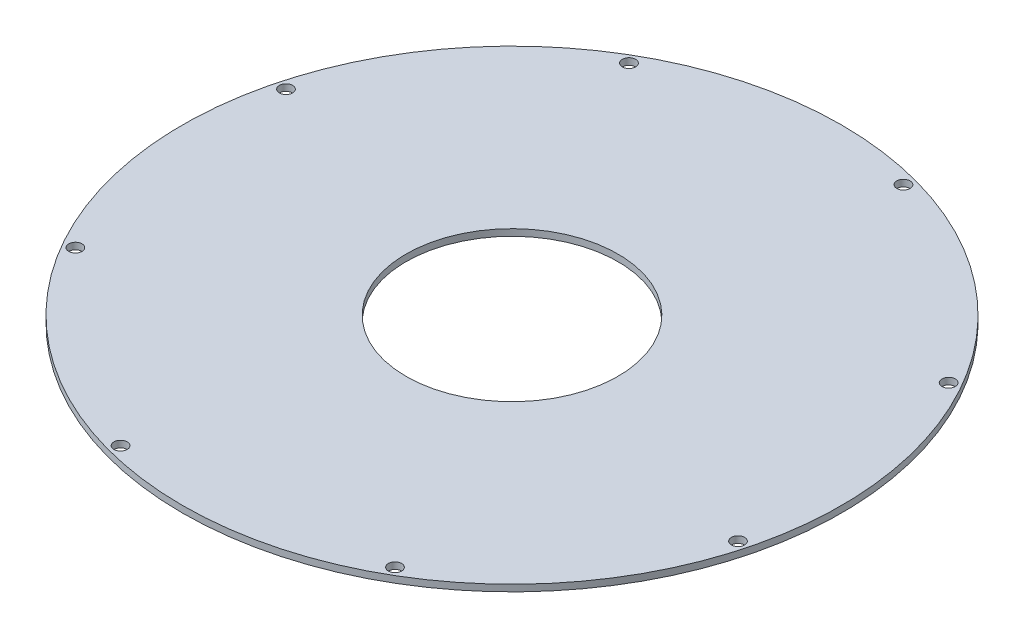
ISO-10303-21;
HEADER;
FILE_DESCRIPTION(('STEP AP214'),'2;1');
FILE_NAME('part.step','',(''),(''),'','','');
FILE_SCHEMA(('AUTOMOTIVE_DESIGN { 1 0 10303 214 1 1 1 1 }'));
ENDSEC;
DATA;
#1=APPLICATION_CONTEXT('core data for automotive mechanical design processes');
#2=APPLICATION_PROTOCOL_DEFINITION('international standard','automotive_design',2000,#1);
#3=PRODUCT_CONTEXT('',#1,'mechanical');
#4=PRODUCT('Part','Part','',(#3));
#5=PRODUCT_RELATED_PRODUCT_CATEGORY('part','',(#4));
#6=PRODUCT_DEFINITION_FORMATION('','',#4);
#7=PRODUCT_DEFINITION_CONTEXT('part definition',#1,'design');
#8=PRODUCT_DEFINITION('design','',#6,#7);
#9=PRODUCT_DEFINITION_SHAPE('','',#8);
#10=(LENGTH_UNIT() NAMED_UNIT(*) SI_UNIT(.MILLI.,.METRE.));
#11=(NAMED_UNIT(*) PLANE_ANGLE_UNIT() SI_UNIT($,.RADIAN.));
#12=(NAMED_UNIT(*) SI_UNIT($,.STERADIAN.) SOLID_ANGLE_UNIT());
#13=UNCERTAINTY_MEASURE_WITH_UNIT(LENGTH_MEASURE(1.E-05),#10,'distance_accuracy_value','');
#14=(GEOMETRIC_REPRESENTATION_CONTEXT(3) GLOBAL_UNCERTAINTY_ASSIGNED_CONTEXT((#13)) GLOBAL_UNIT_ASSIGNED_CONTEXT((#10,
#11,#12)) REPRESENTATION_CONTEXT('',''));
#15=CARTESIAN_POINT('',(0.,0.,0.));
#16=DIRECTION('',(0.,0.,1.));
#17=DIRECTION('',(1.,0.,0.));
#18=AXIS2_PLACEMENT_3D('',#15,#16,#17);
#19=CARTESIAN_POINT('',(0.,1.,0.));
#20=DIRECTION('',(0.,1.,0.));
#21=DIRECTION('',(0.,0.,1.));
#22=AXIS2_PLACEMENT_3D('',#19,#20,#21);
#23=PLANE('',#22);
#24=CARTESIAN_POINT('',(-48.2500000000007,1.,-83.5714514651979));
#25=DIRECTION('',(0.,1.,0.));
#26=DIRECTION('',(0.707106781186549,0.,0.707106781186546));
#27=AXIS2_PLACEMENT_3D('',#24,#25,#26);
#28=CIRCLE('',#27,2.);
#29=CARTESIAN_POINT('',(-46.8357864376276,1.,-82.1572379028248));
#30=VERTEX_POINT('',#29);
#31=EDGE_CURVE('E96',#30,#30,#28,.T.);
#32=ORIENTED_EDGE('',*,*,#31,.F.);
#33=EDGE_LOOP('',(#32));
#34=FACE_BOUND('',#33,.T.);
#35=CARTESIAN_POINT('',(-93.2118422368954,1.,-24.9760378523923));
#36=DIRECTION('',(0.,1.,0.));
#37=DIRECTION('',(1.,0.,0.));
#38=AXIS2_PLACEMENT_3D('',#35,#36,#37);
#39=CIRCLE('',#38,2.);
#40=CARTESIAN_POINT('',(-91.2118422368954,1.,-24.9760378523923));
#41=VERTEX_POINT('',#40);
#42=EDGE_CURVE('E90',#41,#41,#39,.T.);
#43=ORIENTED_EDGE('',*,*,#42,.F.);
#44=EDGE_LOOP('',(#43));
#45=FACE_BOUND('',#44,.T.);
#46=CARTESIAN_POINT('',(-83.5714514651978,1.,48.250000000001));
#47=DIRECTION('',(0.,1.,0.));
#48=DIRECTION('',(0.707106781186544,0.,-0.707106781186551));
#49=AXIS2_PLACEMENT_3D('',#46,#47,#48);
#50=CIRCLE('',#49,2.);
#51=CARTESIAN_POINT('',(-82.1572379028247,1.,46.8357864376279));
#52=VERTEX_POINT('',#51);
#53=EDGE_CURVE('E84',#52,#52,#50,.T.);
#54=ORIENTED_EDGE('',*,*,#53,.F.);
#55=EDGE_LOOP('',(#54));
#56=FACE_BOUND('',#55,.T.);
#57=CARTESIAN_POINT('',(-24.9760378523926,1.,93.2118422368953));
#58=DIRECTION('',(0.,1.,0.));
#59=DIRECTION('',(0.,0.,-1.));
#60=AXIS2_PLACEMENT_3D('',#57,#58,#59);
#61=CIRCLE('',#60,2.);
#62=CARTESIAN_POINT('',(-24.9760378523926,1.,91.2118422368953));
#63=VERTEX_POINT('',#62);
#64=EDGE_CURVE('E78',#63,#63,#61,.T.);
#65=ORIENTED_EDGE('',*,*,#64,.F.);
#66=EDGE_LOOP('',(#65));
#67=FACE_BOUND('',#66,.T.);
#68=CARTESIAN_POINT('',(48.2500000000013,1.,83.5714514651976));
#69=DIRECTION('',(0.,1.,0.));
#70=DIRECTION('',(-0.707106781186554,0.,-0.707106781186541));
#71=AXIS2_PLACEMENT_3D('',#68,#69,#70);
#72=CIRCLE('',#71,2.);
#73=CARTESIAN_POINT('',(46.8357864376282,1.,82.1572379028245));
#74=VERTEX_POINT('',#73);
#75=EDGE_CURVE('E72',#74,#74,#72,.T.);
#76=ORIENTED_EDGE('',*,*,#75,.F.);
#77=EDGE_LOOP('',(#76));
#78=FACE_BOUND('',#77,.T.);
#79=CARTESIAN_POINT('',(93.2118422368955,1.,24.9760378523917));
#80=DIRECTION('',(0.,1.,0.));
#81=DIRECTION('',(-1.,0.,0.));
#82=AXIS2_PLACEMENT_3D('',#79,#80,#81);
#83=CIRCLE('',#82,2.);
#84=CARTESIAN_POINT('',(91.2118422368955,1.,24.9760378523917));
#85=VERTEX_POINT('',#84);
#86=EDGE_CURVE('E66',#85,#85,#83,.T.);
#87=ORIENTED_EDGE('',*,*,#86,.F.);
#88=EDGE_LOOP('',(#87));
#89=FACE_BOUND('',#88,.T.);
#90=CARTESIAN_POINT('',(83.5714514651974,1.,-48.2500000000016));
#91=DIRECTION('',(0.,1.,0.));
#92=DIRECTION('',(-0.707106781186539,0.,0.707106781186556));
#93=AXIS2_PLACEMENT_3D('',#90,#91,#92);
#94=CIRCLE('',#93,2.);
#95=CARTESIAN_POINT('',(82.1572379028243,1.,-46.8357864376285));
#96=VERTEX_POINT('',#95);
#97=EDGE_CURVE('E60',#96,#96,#94,.T.);
#98=ORIENTED_EDGE('',*,*,#97,.F.);
#99=EDGE_LOOP('',(#98));
#100=FACE_BOUND('',#99,.T.);
#101=CARTESIAN_POINT('',(24.9760378523926,1.,-93.2118422368953));
#102=DIRECTION('',(0.,1.,0.));
#103=DIRECTION('',(0.,0.,1.));
#104=AXIS2_PLACEMENT_3D('',#101,#102,#103);
#105=CIRCLE('',#104,2.);
#106=CARTESIAN_POINT('',(24.9760378523926,1.,-91.2118422368953));
#107=VERTEX_POINT('',#106);
#108=EDGE_CURVE('E54',#107,#107,#105,.T.);
#109=ORIENTED_EDGE('',*,*,#108,.F.);
#110=EDGE_LOOP('',(#109));
#111=FACE_BOUND('',#110,.T.);
#112=CARTESIAN_POINT('',(0.,1.,0.));
#113=DIRECTION('',(0.,1.,0.));
#114=DIRECTION('',(0.,0.,1.));
#115=AXIS2_PLACEMENT_3D('',#112,#113,#114);
#116=CIRCLE('',#115,99.5);
#117=CARTESIAN_POINT('',(0.,1.,99.5));
#118=VERTEX_POINT('',#117);
#119=EDGE_CURVE('E10',#118,#118,#116,.T.);
#120=ORIENTED_EDGE('',*,*,#119,.T.);
#121=EDGE_LOOP('',(#120));
#122=FACE_BOUND('',#121,.T.);
#123=CARTESIAN_POINT('',(0.,1.,0.));
#124=DIRECTION('',(0.,1.,0.));
#125=DIRECTION('',(0.,0.,1.));
#126=AXIS2_PLACEMENT_3D('',#123,#124,#125);
#127=CIRCLE('',#126,32.);
#128=CARTESIAN_POINT('',(0.,1.,32.));
#129=VERTEX_POINT('',#128);
#130=EDGE_CURVE('E46',#129,#129,#127,.T.);
#131=ORIENTED_EDGE('',*,*,#130,.F.);
#132=EDGE_LOOP('',(#131));
#133=FACE_BOUND('',#132,.T.);
#134=ADVANCED_FACE('F35',(#34,#45,#56,#67,#78,#89,#100,#111,#122,#133),#23,.T.);
#135=CARTESIAN_POINT('',(0.,-1.,0.));
#136=DIRECTION('',(0.,1.,0.));
#137=DIRECTION('',(0.,0.,1.));
#138=AXIS2_PLACEMENT_3D('',#135,#136,#137);
#139=PLANE('',#138);
#140=CARTESIAN_POINT('',(-48.2500000000007,-1.,-83.5714514651979));
#141=DIRECTION('',(0.,1.,0.));
#142=DIRECTION('',(0.707106781186549,0.,0.707106781186546));
#143=AXIS2_PLACEMENT_3D('',#140,#141,#142);
#144=CIRCLE('',#143,2.);
#145=CARTESIAN_POINT('',(-46.8357864376276,-1.,-82.1572379028248));
#146=VERTEX_POINT('',#145);
#147=EDGE_CURVE('E57',#146,#146,#144,.T.);
#148=ORIENTED_EDGE('',*,*,#147,.T.);
#149=EDGE_LOOP('',(#148));
#150=FACE_BOUND('',#149,.T.);
#151=CARTESIAN_POINT('',(-93.2118422368954,-1.,-24.9760378523923));
#152=DIRECTION('',(0.,1.,0.));
#153=DIRECTION('',(1.,0.,0.));
#154=AXIS2_PLACEMENT_3D('',#151,#152,#153);
#155=CIRCLE('',#154,2.);
#156=CARTESIAN_POINT('',(-91.2118422368954,-1.,-24.9760378523923));
#157=VERTEX_POINT('',#156);
#158=EDGE_CURVE('E93',#157,#157,#155,.T.);
#159=ORIENTED_EDGE('',*,*,#158,.T.);
#160=EDGE_LOOP('',(#159));
#161=FACE_BOUND('',#160,.T.);
#162=CARTESIAN_POINT('',(-83.5714514651978,-1.,48.250000000001));
#163=DIRECTION('',(0.,1.,0.));
#164=DIRECTION('',(0.707106781186544,0.,-0.707106781186551));
#165=AXIS2_PLACEMENT_3D('',#162,#163,#164);
#166=CIRCLE('',#165,2.);
#167=CARTESIAN_POINT('',(-82.1572379028247,-1.,46.8357864376279));
#168=VERTEX_POINT('',#167);
#169=EDGE_CURVE('E87',#168,#168,#166,.T.);
#170=ORIENTED_EDGE('',*,*,#169,.T.);
#171=EDGE_LOOP('',(#170));
#172=FACE_BOUND('',#171,.T.);
#173=CARTESIAN_POINT('',(-24.9760378523926,-1.,93.2118422368953));
#174=DIRECTION('',(0.,1.,0.));
#175=DIRECTION('',(0.,0.,-1.));
#176=AXIS2_PLACEMENT_3D('',#173,#174,#175);
#177=CIRCLE('',#176,2.);
#178=CARTESIAN_POINT('',(-24.9760378523926,-1.,91.2118422368953));
#179=VERTEX_POINT('',#178);
#180=EDGE_CURVE('E81',#179,#179,#177,.T.);
#181=ORIENTED_EDGE('',*,*,#180,.T.);
#182=EDGE_LOOP('',(#181));
#183=FACE_BOUND('',#182,.T.);
#184=CARTESIAN_POINT('',(48.2500000000013,-1.,83.5714514651976));
#185=DIRECTION('',(0.,1.,0.));
#186=DIRECTION('',(-0.707106781186554,0.,-0.707106781186541));
#187=AXIS2_PLACEMENT_3D('',#184,#185,#186);
#188=CIRCLE('',#187,2.);
#189=CARTESIAN_POINT('',(46.8357864376282,-1.,82.1572379028245));
#190=VERTEX_POINT('',#189);
#191=EDGE_CURVE('E75',#190,#190,#188,.T.);
#192=ORIENTED_EDGE('',*,*,#191,.T.);
#193=EDGE_LOOP('',(#192));
#194=FACE_BOUND('',#193,.T.);
#195=CARTESIAN_POINT('',(93.2118422368955,-1.,24.9760378523917));
#196=DIRECTION('',(0.,1.,0.));
#197=DIRECTION('',(-1.,0.,0.));
#198=AXIS2_PLACEMENT_3D('',#195,#196,#197);
#199=CIRCLE('',#198,2.);
#200=CARTESIAN_POINT('',(91.2118422368955,-1.,24.9760378523917));
#201=VERTEX_POINT('',#200);
#202=EDGE_CURVE('E69',#201,#201,#199,.T.);
#203=ORIENTED_EDGE('',*,*,#202,.T.);
#204=EDGE_LOOP('',(#203));
#205=FACE_BOUND('',#204,.T.);
#206=CARTESIAN_POINT('',(83.5714514651974,-1.,-48.2500000000016));
#207=DIRECTION('',(0.,1.,0.));
#208=DIRECTION('',(-0.707106781186539,0.,0.707106781186556));
#209=AXIS2_PLACEMENT_3D('',#206,#207,#208);
#210=CIRCLE('',#209,2.);
#211=CARTESIAN_POINT('',(82.1572379028243,-1.,-46.8357864376285));
#212=VERTEX_POINT('',#211);
#213=EDGE_CURVE('E63',#212,#212,#210,.T.);
#214=ORIENTED_EDGE('',*,*,#213,.T.);
#215=EDGE_LOOP('',(#214));
#216=FACE_BOUND('',#215,.T.);
#217=CARTESIAN_POINT('',(24.9760378523926,-1.,-93.2118422368953));
#218=DIRECTION('',(0.,1.,0.));
#219=DIRECTION('',(0.,0.,1.));
#220=AXIS2_PLACEMENT_3D('',#217,#218,#219);
#221=CIRCLE('',#220,2.);
#222=CARTESIAN_POINT('',(24.9760378523926,-1.,-91.2118422368953));
#223=VERTEX_POINT('',#222);
#224=EDGE_CURVE('E51',#223,#223,#221,.T.);
#225=ORIENTED_EDGE('',*,*,#224,.T.);
#226=EDGE_LOOP('',(#225));
#227=FACE_BOUND('',#226,.T.);
#228=CARTESIAN_POINT('',(0.,-1.,0.));
#229=DIRECTION('',(0.,1.,0.));
#230=DIRECTION('',(0.,0.,1.));
#231=AXIS2_PLACEMENT_3D('',#228,#229,#230);
#232=CIRCLE('',#231,99.5);
#233=CARTESIAN_POINT('',(0.,-1.,99.5));
#234=VERTEX_POINT('',#233);
#235=EDGE_CURVE('E39',#234,#234,#232,.T.);
#236=ORIENTED_EDGE('',*,*,#235,.F.);
#237=EDGE_LOOP('',(#236));
#238=FACE_BOUND('',#237,.T.);
#239=CARTESIAN_POINT('',(0.,-1.,0.));
#240=DIRECTION('',(0.,1.,0.));
#241=DIRECTION('',(0.,0.,1.));
#242=AXIS2_PLACEMENT_3D('',#239,#240,#241);
#243=CIRCLE('',#242,32.);
#244=CARTESIAN_POINT('',(0.,-1.,32.));
#245=VERTEX_POINT('',#244);
#246=EDGE_CURVE('E48',#245,#245,#243,.T.);
#247=ORIENTED_EDGE('',*,*,#246,.T.);
#248=EDGE_LOOP('',(#247));
#249=FACE_BOUND('',#248,.T.);
#250=ADVANCED_FACE('F102',(#150,#161,#172,#183,#194,#205,#216,#227,#238,#249),#139,.F.);
#251=CARTESIAN_POINT('',(0.,1.,0.));
#252=DIRECTION('',(0.,-1.,0.));
#253=DIRECTION('',(0.,0.,-1.));
#254=AXIS2_PLACEMENT_3D('',#251,#252,#253);
#255=CYLINDRICAL_SURFACE('',#254,99.5);
#256=ORIENTED_EDGE('',*,*,#119,.F.);
#257=EDGE_LOOP('',(#256));
#258=FACE_BOUND('',#257,.T.);
#259=ORIENTED_EDGE('',*,*,#235,.T.);
#260=EDGE_LOOP('',(#259));
#261=FACE_BOUND('',#260,.T.);
#262=ADVANCED_FACE('F37',(#258,#261),#255,.T.);
#263=CARTESIAN_POINT('',(0.,1.,0.));
#264=DIRECTION('',(0.,-1.,0.));
#265=DIRECTION('',(0.,0.,-1.));
#266=AXIS2_PLACEMENT_3D('',#263,#264,#265);
#267=CYLINDRICAL_SURFACE('',#266,32.);
#268=ORIENTED_EDGE('',*,*,#130,.T.);
#269=EDGE_LOOP('',(#268));
#270=FACE_BOUND('',#269,.T.);
#271=ORIENTED_EDGE('',*,*,#246,.F.);
#272=EDGE_LOOP('',(#271));
#273=FACE_BOUND('',#272,.T.);
#274=ADVANCED_FACE('F131',(#270,#273),#267,.F.);
#275=CARTESIAN_POINT('',(24.9760378523926,-1.,-93.2118422368953));
#276=DIRECTION('',(0.,1.,0.));
#277=DIRECTION('',(0.,0.,1.));
#278=AXIS2_PLACEMENT_3D('',#275,#276,#277);
#279=CYLINDRICAL_SURFACE('',#278,2.);
#280=ORIENTED_EDGE('',*,*,#224,.F.);
#281=EDGE_LOOP('',(#280));
#282=FACE_BOUND('',#281,.T.);
#283=ORIENTED_EDGE('',*,*,#108,.T.);
#284=EDGE_LOOP('',(#283));
#285=FACE_BOUND('',#284,.T.);
#286=ADVANCED_FACE('F134',(#282,#285),#279,.F.);
#287=CARTESIAN_POINT('',(83.5714514651974,-1.,-48.2500000000016));
#288=DIRECTION('',(0.,1.,0.));
#289=DIRECTION('',(0.,0.,1.));
#290=AXIS2_PLACEMENT_3D('',#287,#288,#289);
#291=CYLINDRICAL_SURFACE('',#290,2.);
#292=ORIENTED_EDGE('',*,*,#213,.F.);
#293=EDGE_LOOP('',(#292));
#294=FACE_BOUND('',#293,.T.);
#295=ORIENTED_EDGE('',*,*,#97,.T.);
#296=EDGE_LOOP('',(#295));
#297=FACE_BOUND('',#296,.T.);
#298=ADVANCED_FACE('F146',(#294,#297),#291,.F.);
#299=CARTESIAN_POINT('',(93.2118422368955,-1.,24.9760378523917));
#300=DIRECTION('',(0.,1.,0.));
#301=DIRECTION('',(0.,0.,1.));
#302=AXIS2_PLACEMENT_3D('',#299,#300,#301);
#303=CYLINDRICAL_SURFACE('',#302,2.);
#304=ORIENTED_EDGE('',*,*,#202,.F.);
#305=EDGE_LOOP('',(#304));
#306=FACE_BOUND('',#305,.T.);
#307=ORIENTED_EDGE('',*,*,#86,.T.);
#308=EDGE_LOOP('',(#307));
#309=FACE_BOUND('',#308,.T.);
#310=ADVANCED_FACE('F150',(#306,#309),#303,.F.);
#311=CARTESIAN_POINT('',(48.2500000000013,-1.,83.5714514651976));
#312=DIRECTION('',(0.,1.,0.));
#313=DIRECTION('',(0.,0.,1.));
#314=AXIS2_PLACEMENT_3D('',#311,#312,#313);
#315=CYLINDRICAL_SURFACE('',#314,2.);
#316=ORIENTED_EDGE('',*,*,#191,.F.);
#317=EDGE_LOOP('',(#316));
#318=FACE_BOUND('',#317,.T.);
#319=ORIENTED_EDGE('',*,*,#75,.T.);
#320=EDGE_LOOP('',(#319));
#321=FACE_BOUND('',#320,.T.);
#322=ADVANCED_FACE('F154',(#318,#321),#315,.F.);
#323=CARTESIAN_POINT('',(-24.9760378523926,-1.,93.2118422368953));
#324=DIRECTION('',(0.,1.,0.));
#325=DIRECTION('',(0.,0.,1.));
#326=AXIS2_PLACEMENT_3D('',#323,#324,#325);
#327=CYLINDRICAL_SURFACE('',#326,2.);
#328=ORIENTED_EDGE('',*,*,#180,.F.);
#329=EDGE_LOOP('',(#328));
#330=FACE_BOUND('',#329,.T.);
#331=ORIENTED_EDGE('',*,*,#64,.T.);
#332=EDGE_LOOP('',(#331));
#333=FACE_BOUND('',#332,.T.);
#334=ADVANCED_FACE('F158',(#330,#333),#327,.F.);
#335=CARTESIAN_POINT('',(-83.5714514651978,-1.,48.250000000001));
#336=DIRECTION('',(0.,1.,0.));
#337=DIRECTION('',(0.,0.,1.));
#338=AXIS2_PLACEMENT_3D('',#335,#336,#337);
#339=CYLINDRICAL_SURFACE('',#338,2.);
#340=ORIENTED_EDGE('',*,*,#169,.F.);
#341=EDGE_LOOP('',(#340));
#342=FACE_BOUND('',#341,.T.);
#343=ORIENTED_EDGE('',*,*,#53,.T.);
#344=EDGE_LOOP('',(#343));
#345=FACE_BOUND('',#344,.T.);
#346=ADVANCED_FACE('F162',(#342,#345),#339,.F.);
#347=CARTESIAN_POINT('',(-93.2118422368954,-1.,-24.9760378523923));
#348=DIRECTION('',(0.,1.,0.));
#349=DIRECTION('',(0.,0.,1.));
#350=AXIS2_PLACEMENT_3D('',#347,#348,#349);
#351=CYLINDRICAL_SURFACE('',#350,2.);
#352=ORIENTED_EDGE('',*,*,#158,.F.);
#353=EDGE_LOOP('',(#352));
#354=FACE_BOUND('',#353,.T.);
#355=ORIENTED_EDGE('',*,*,#42,.T.);
#356=EDGE_LOOP('',(#355));
#357=FACE_BOUND('',#356,.T.);
#358=ADVANCED_FACE('F108',(#354,#357),#351,.F.);
#359=CARTESIAN_POINT('',(-48.2500000000007,-1.,-83.5714514651979));
#360=DIRECTION('',(0.,1.,0.));
#361=DIRECTION('',(0.,0.,1.));
#362=AXIS2_PLACEMENT_3D('',#359,#360,#361);
#363=CYLINDRICAL_SURFACE('',#362,2.);
#364=ORIENTED_EDGE('',*,*,#147,.F.);
#365=EDGE_LOOP('',(#364));
#366=FACE_BOUND('',#365,.T.);
#367=ORIENTED_EDGE('',*,*,#31,.T.);
#368=EDGE_LOOP('',(#367));
#369=FACE_BOUND('',#368,.T.);
#370=ADVANCED_FACE('F105',(#366,#369),#363,.F.);
#371=CLOSED_SHELL('',(#134,#250,#262,#274,#286,#298,#310,#322,#334,#346,#358,#370));
#372=MANIFOLD_SOLID_BREP('B2',#371);
#373=ADVANCED_BREP_SHAPE_REPRESENTATION('',(#18,#372),#14);
#374=SHAPE_DEFINITION_REPRESENTATION(#9,#373);
ENDSEC;
END-ISO-10303-21;
